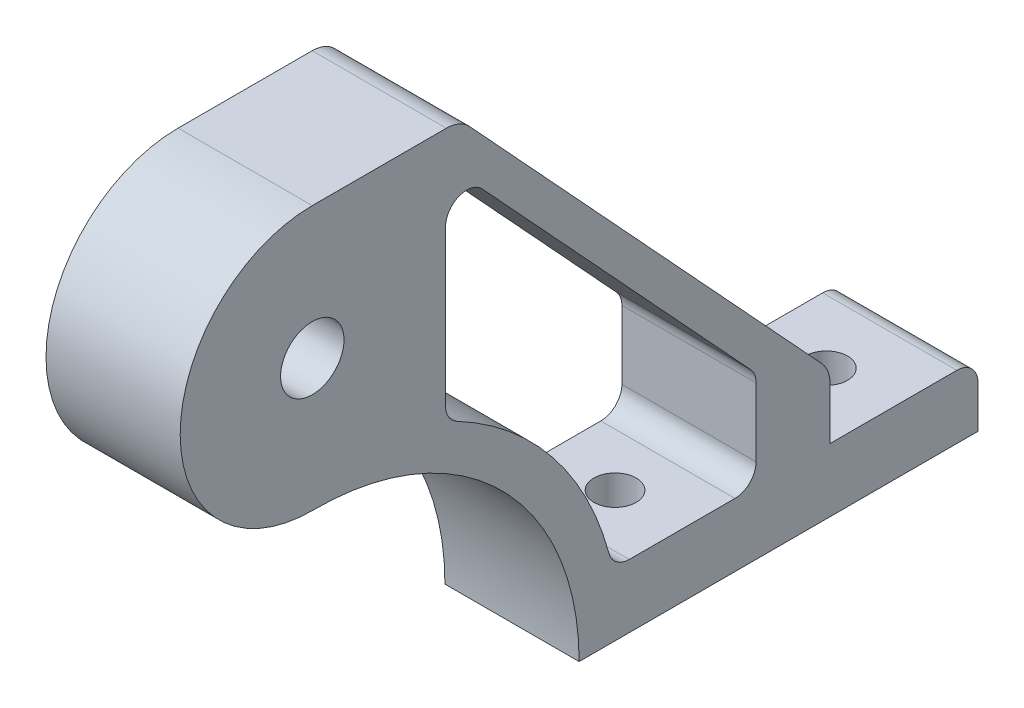
ISO-10303-21;
HEADER;
FILE_DESCRIPTION(('STEP AP214'),'2;1');
FILE_NAME('part.step','',(''),(''),'','','');
FILE_SCHEMA(('AUTOMOTIVE_DESIGN { 1 0 10303 214 1 1 1 1 }'));
ENDSEC;
DATA;
#1=APPLICATION_CONTEXT('core data for automotive mechanical design processes');
#2=APPLICATION_PROTOCOL_DEFINITION('international standard','automotive_design',2000,#1);
#3=PRODUCT_CONTEXT('',#1,'mechanical');
#4=PRODUCT('Part','Part','',(#3));
#5=PRODUCT_RELATED_PRODUCT_CATEGORY('part','',(#4));
#6=PRODUCT_DEFINITION_FORMATION('','',#4);
#7=PRODUCT_DEFINITION_CONTEXT('part definition',#1,'design');
#8=PRODUCT_DEFINITION('design','',#6,#7);
#9=PRODUCT_DEFINITION_SHAPE('','',#8);
#10=(LENGTH_UNIT() NAMED_UNIT(*) SI_UNIT(.MILLI.,.METRE.));
#11=(NAMED_UNIT(*) PLANE_ANGLE_UNIT() SI_UNIT($,.RADIAN.));
#12=(NAMED_UNIT(*) SI_UNIT($,.STERADIAN.) SOLID_ANGLE_UNIT());
#13=UNCERTAINTY_MEASURE_WITH_UNIT(LENGTH_MEASURE(1.E-05),#10,'distance_accuracy_value','');
#14=(GEOMETRIC_REPRESENTATION_CONTEXT(3) GLOBAL_UNCERTAINTY_ASSIGNED_CONTEXT((#13)) GLOBAL_UNIT_ASSIGNED_CONTEXT((#10,
#11,#12)) REPRESENTATION_CONTEXT('',''));
#15=CARTESIAN_POINT('',(0.,0.,0.));
#16=DIRECTION('',(0.,0.,1.));
#17=DIRECTION('',(1.,0.,0.));
#18=AXIS2_PLACEMENT_3D('',#15,#16,#17);
#19=CARTESIAN_POINT('',(12.7,35.5000000000114,-0.999999999997256));
#20=DIRECTION('',(-1.,0.,0.));
#21=DIRECTION('',(0.,0.,1.));
#22=AXIS2_PLACEMENT_3D('',#19,#20,#21);
#23=PLANE('',#22);
#24=CARTESIAN_POINT('',(12.7,35.5000000000114,-0.999999999997256));
#25=DIRECTION('',(1.,0.,0.));
#26=DIRECTION('',(0.,0.,-1.));
#27=AXIS2_PLACEMENT_3D('',#24,#25,#26);
#28=CIRCLE('',#27,3.);
#29=CARTESIAN_POINT('',(12.7,35.5000000000114,-3.99999999999726));
#30=VERTEX_POINT('',#29);
#31=EDGE_CURVE('E265',#30,#30,#28,.T.);
#32=ORIENTED_EDGE('',*,*,#31,.F.);
#33=EDGE_LOOP('',(#32));
#34=FACE_BOUND('',#33,.T.);
#35=CARTESIAN_POINT('',(12.7,35.5000000000114,-0.999999999997256));
#36=DIRECTION('',(1.,0.,0.));
#37=DIRECTION('',(0.,0.,1.));
#38=AXIS2_PLACEMENT_3D('',#35,#36,#37);
#39=CIRCLE('',#38,12.5);
#40=CARTESIAN_POINT('',(12.7,48.0000000000114,-0.999999999997256));
#41=VERTEX_POINT('',#40);
#42=CARTESIAN_POINT('',(12.7,23.0002868626044,-1.08468460623368));
#43=VERTEX_POINT('',#42);
#44=EDGE_CURVE('E271',#41,#43,#39,.T.);
#45=ORIENTED_EDGE('',*,*,#44,.T.);
#46=CARTESIAN_POINT('',(12.7,-1.99913941220975,-1.25405381870654));
#47=DIRECTION('',(-1.,0.,0.));
#48=DIRECTION('',(0.,0.,1.));
#49=AXIS2_PLACEMENT_3D('',#46,#47,#48);
#50=CIRCLE('',#49,25.);
#51=CARTESIAN_POINT('',(12.7,-1.99913941220964,-26.2540538187065));
#52=VERTEX_POINT('',#51);
#53=EDGE_CURVE('E274',#43,#52,#50,.T.);
#54=ORIENTED_EDGE('',*,*,#53,.T.);
#55=DIRECTION('',(0.,0.,-1.));
#56=VECTOR('',#55,1.);
#57=CARTESIAN_POINT('',(12.7,-1.99913941220964,-26.2540538187065));
#58=LINE('',#57,#56);
#59=CARTESIAN_POINT('',(12.7,-1.99913941220963,-63.9999999999972));
#60=VERTEX_POINT('',#59);
#61=EDGE_CURVE('E277',#52,#60,#58,.T.);
#62=ORIENTED_EDGE('',*,*,#61,.T.);
#63=DIRECTION('',(0.,1.,0.));
#64=VECTOR('',#63,1.);
#65=CARTESIAN_POINT('',(12.7,2.00086058779035,-63.9999999999973));
#66=LINE('',#65,#64);
#67=CARTESIAN_POINT('',(12.7,2.00086058779035,-63.9999999999973));
#68=VERTEX_POINT('',#67);
#69=EDGE_CURVE('E279',#60,#68,#66,.T.);
#70=ORIENTED_EDGE('',*,*,#69,.T.);
#71=CARTESIAN_POINT('',(12.7,2.00086058779037,-61.9999999999973));
#72=DIRECTION('',(1.,0.,0.));
#73=DIRECTION('',(0.,0.,1.));
#74=AXIS2_PLACEMENT_3D('',#71,#72,#73);
#75=CIRCLE('',#74,2.);
#76=CARTESIAN_POINT('',(12.7,4.00086058779037,-61.9999999999972));
#77=VERTEX_POINT('',#76);
#78=EDGE_CURVE('E281',#68,#77,#75,.T.);
#79=ORIENTED_EDGE('',*,*,#78,.T.);
#80=DIRECTION('',(0.,0.,1.));
#81=VECTOR('',#80,1.);
#82=CARTESIAN_POINT('',(12.7,4.00086058779036,-49.9999999999973));
#83=LINE('',#82,#81);
#84=CARTESIAN_POINT('',(12.7,4.00086058779036,-49.9999999999973));
#85=VERTEX_POINT('',#84);
#86=EDGE_CURVE('E283',#77,#85,#83,.T.);
#87=ORIENTED_EDGE('',*,*,#86,.T.);
#88=DIRECTION('',(0.,1.,0.));
#89=VECTOR('',#88,1.);
#90=CARTESIAN_POINT('',(12.7,4.00086058779036,-49.9999999999973));
#91=LINE('',#90,#89);
#92=CARTESIAN_POINT('',(12.7,8.92166748068362,-49.9999999999973));
#93=VERTEX_POINT('',#92);
#94=EDGE_CURVE('E285',#85,#93,#91,.T.);
#95=ORIENTED_EDGE('',*,*,#94,.T.);
#96=CARTESIAN_POINT('',(12.7,8.92166748068362,-46.9999999999973));
#97=DIRECTION('',(1.,0.,0.));
#98=DIRECTION('',(0.,0.,1.));
#99=AXIS2_PLACEMENT_3D('',#96,#97,#98);
#100=CIRCLE('',#99,3.);
#101=CARTESIAN_POINT('',(12.7,10.9568424444333,-49.2041013740104));
#102=VERTEX_POINT('',#101);
#103=EDGE_CURVE('E287',#93,#102,#100,.T.);
#104=ORIENTED_EDGE('',*,*,#103,.T.);
#105=DIRECTION('',(0.,0.734700458004377,0.67839165458322));
#106=VECTOR('',#105,1.);
#107=CARTESIAN_POINT('',(12.7,10.9568424444333,-49.2041013740104));
#108=LINE('',#107,#106);
#109=CARTESIAN_POINT('',(12.7,47.0351749637611,-15.8908790590672));
#110=VERTEX_POINT('',#109);
#111=EDGE_CURVE('E289',#102,#110,#108,.T.);
#112=ORIENTED_EDGE('',*,*,#111,.T.);
#113=CARTESIAN_POINT('',(12.7,45.0000000000114,-13.6867776850541));
#114=DIRECTION('',(1.,0.,0.));
#115=DIRECTION('',(0.,0.,-1.));
#116=AXIS2_PLACEMENT_3D('',#113,#114,#115);
#117=CIRCLE('',#116,3.);
#118=CARTESIAN_POINT('',(12.7,48.0000000000114,-13.6867776850541));
#119=VERTEX_POINT('',#118);
#120=EDGE_CURVE('E291',#110,#119,#117,.T.);
#121=ORIENTED_EDGE('',*,*,#120,.T.);
#122=DIRECTION('',(0.,0.,1.));
#123=VECTOR('',#122,1.);
#124=CARTESIAN_POINT('',(12.7,48.0000000000114,-0.999999999997256));
#125=LINE('',#124,#123);
#126=EDGE_CURVE('E293',#119,#41,#125,.T.);
#127=ORIENTED_EDGE('',*,*,#126,.T.);
#128=EDGE_LOOP('',(#45,#54,#62,#70,#79,#87,#95,#104,#112,#121,#127));
#129=FACE_BOUND('',#128,.T.);
#130=CARTESIAN_POINT('',(12.7,12.4715383137878,-40.9999999999973));
#131=DIRECTION('',(1.,0.,0.));
#132=DIRECTION('',(0.,0.,1.));
#133=AXIS2_PLACEMENT_3D('',#130,#131,#132);
#134=CIRCLE('',#133,2.);
#135=CARTESIAN_POINT('',(12.7,12.4715383137878,-42.9999999999973));
#136=VERTEX_POINT('',#135);
#137=CARTESIAN_POINT('',(12.7,13.8283216229542,-42.469400916006));
#138=VERTEX_POINT('',#137);
#139=EDGE_CURVE('E184',#136,#138,#134,.T.);
#140=ORIENTED_EDGE('',*,*,#139,.F.);
#141=DIRECTION('',(0.,1.,0.));
#142=VECTOR('',#141,1.);
#143=CARTESIAN_POINT('',(12.7,12.4715383137878,-42.9999999999973));
#144=LINE('',#143,#142);
#145=CARTESIAN_POINT('',(12.7,6.00086058779037,-42.9999999999973));
#146=VERTEX_POINT('',#145);
#147=EDGE_CURVE('E222',#146,#136,#144,.T.);
#148=ORIENTED_EDGE('',*,*,#147,.F.);
#149=CARTESIAN_POINT('',(12.7,6.00086058779037,-40.9999999999973));
#150=DIRECTION('',(1.,0.,0.));
#151=DIRECTION('',(0.,0.,1.));
#152=AXIS2_PLACEMENT_3D('',#149,#150,#151);
#153=CIRCLE('',#152,2.);
#154=CARTESIAN_POINT('',(12.7,4.00086058779036,-40.9999999999973));
#155=VERTEX_POINT('',#154);
#156=EDGE_CURVE('E220',#155,#146,#153,.T.);
#157=ORIENTED_EDGE('',*,*,#156,.F.);
#158=DIRECTION('',(0.,0.,-1.));
#159=VECTOR('',#158,1.);
#160=CARTESIAN_POINT('',(12.7,4.00086058779036,-40.9999999999973));
#161=LINE('',#160,#159);
#162=CARTESIAN_POINT('',(12.7,4.00086058779037,-30.9999999999973));
#163=VERTEX_POINT('',#162);
#164=EDGE_CURVE('E218',#163,#155,#161,.T.);
#165=ORIENTED_EDGE('',*,*,#164,.F.);
#166=CARTESIAN_POINT('',(12.7,6.00086058779036,-30.9999999999973));
#167=DIRECTION('',(1.,0.,0.));
#168=DIRECTION('',(0.,0.,1.));
#169=AXIS2_PLACEMENT_3D('',#166,#167,#168);
#170=CIRCLE('',#169,2.);
#171=CARTESIAN_POINT('',(12.7,5.4814297055303,-29.0686296164212));
#172=VERTEX_POINT('',#171);
#173=EDGE_CURVE('E216',#172,#163,#170,.T.);
#174=ORIENTED_EDGE('',*,*,#173,.F.);
#175=CARTESIAN_POINT('',(12.7,-1.99913941220975,-1.25405381870654));
#176=DIRECTION('',(-1.,0.,0.));
#177=DIRECTION('',(0.,0.,-1.));
#178=AXIS2_PLACEMENT_3D('',#175,#176,#177);
#179=CIRCLE('',#178,28.8029432720356);
#180=CARTESIAN_POINT('',(12.7,23.4822233319297,-14.6819983313147));
#181=VERTEX_POINT('',#180);
#182=EDGE_CURVE('E214',#181,#172,#179,.T.);
#183=ORIENTED_EDGE('',*,*,#182,.F.);
#184=CARTESIAN_POINT('',(12.7,25.2515815883742,-15.6143991895038));
#185=DIRECTION('',(1.,0.,0.));
#186=DIRECTION('',(0.,0.,-1.));
#187=AXIS2_PLACEMENT_3D('',#184,#185,#186);
#188=CIRCLE('',#187,2.);
#189=CARTESIAN_POINT('',(12.7,25.2515815883742,-13.6143991895038));
#190=VERTEX_POINT('',#189);
#191=EDGE_CURVE('E212',#190,#181,#188,.T.);
#192=ORIENTED_EDGE('',*,*,#191,.F.);
#193=DIRECTION('',(0.,-1.,0.));
#194=VECTOR('',#193,1.);
#195=CARTESIAN_POINT('',(12.7,39.9642299118946,-13.6143991895038));
#196=LINE('',#195,#194);
#197=CARTESIAN_POINT('',(12.7,39.9642299118946,-13.6143991895038));
#198=VERTEX_POINT('',#197);
#199=EDGE_CURVE('E207',#198,#190,#196,.T.);
#200=ORIENTED_EDGE('',*,*,#199,.F.);
#201=CARTESIAN_POINT('',(12.7,39.9642299118946,-15.6143991895038));
#202=DIRECTION('',(1.,0.,0.));
#203=DIRECTION('',(0.,0.,-1.));
#204=AXIS2_PLACEMENT_3D('',#201,#202,#203);
#205=CIRCLE('',#204,2.);
#206=CARTESIAN_POINT('',(12.7,41.321013221061,-17.0838001055125));
#207=VERTEX_POINT('',#206);
#208=EDGE_CURVE('E205',#207,#198,#205,.T.);
#209=ORIENTED_EDGE('',*,*,#208,.F.);
#210=DIRECTION('',(0.,0.734700458004377,0.67839165458322));
#211=VECTOR('',#210,1.);
#212=CARTESIAN_POINT('',(12.7,13.8283216229542,-42.469400916006));
#213=LINE('',#212,#211);
#214=EDGE_CURVE('E192',#138,#207,#213,.T.);
#215=ORIENTED_EDGE('',*,*,#214,.F.);
#216=EDGE_LOOP('',(#140,#148,#157,#165,#174,#183,#192,#200,#209,#215));
#217=FACE_BOUND('',#216,.T.);
#218=ADVANCED_FACE('F41',(#34,#129,#217),#23,.F.);
#219=CARTESIAN_POINT('',(0.,35.5000000000114,-0.999999999997256));
#220=DIRECTION('',(-1.,0.,0.));
#221=DIRECTION('',(0.,0.,1.));
#222=AXIS2_PLACEMENT_3D('',#219,#220,#221);
#223=PLANE('',#222);
#224=CARTESIAN_POINT('',(0.,35.5000000000114,-0.999999999997256));
#225=DIRECTION('',(1.,0.,0.));
#226=DIRECTION('',(0.,0.,1.));
#227=AXIS2_PLACEMENT_3D('',#224,#225,#226);
#228=CIRCLE('',#227,12.5);
#229=CARTESIAN_POINT('',(0.,48.0000000000114,-0.999999999997256));
#230=VERTEX_POINT('',#229);
#231=CARTESIAN_POINT('',(0.,23.0002868626044,-1.08468460623368));
#232=VERTEX_POINT('',#231);
#233=EDGE_CURVE('E268',#230,#232,#228,.T.);
#234=ORIENTED_EDGE('',*,*,#233,.F.);
#235=DIRECTION('',(0.,0.,1.));
#236=VECTOR('',#235,1.);
#237=CARTESIAN_POINT('',(0.,48.0000000000114,-0.999999999997256));
#238=LINE('',#237,#236);
#239=CARTESIAN_POINT('',(0.,48.0000000000114,-13.6867776850541));
#240=VERTEX_POINT('',#239);
#241=EDGE_CURVE('E275',#240,#230,#238,.T.);
#242=ORIENTED_EDGE('',*,*,#241,.F.);
#243=CARTESIAN_POINT('',(0.,45.0000000000114,-13.6867776850541));
#244=DIRECTION('',(1.,0.,0.));
#245=DIRECTION('',(0.,0.,-1.));
#246=AXIS2_PLACEMENT_3D('',#243,#244,#245);
#247=CIRCLE('',#246,3.);
#248=CARTESIAN_POINT('',(0.,47.0351749637611,-15.8908790590672));
#249=VERTEX_POINT('',#248);
#250=EDGE_CURVE('E314',#249,#240,#247,.T.);
#251=ORIENTED_EDGE('',*,*,#250,.F.);
#252=DIRECTION('',(0.,0.734700458004377,0.67839165458322));
#253=VECTOR('',#252,1.);
#254=CARTESIAN_POINT('',(0.,10.9568424444333,-49.2041013740104));
#255=LINE('',#254,#253);
#256=CARTESIAN_POINT('',(0.,10.9568424444333,-49.2041013740104));
#257=VERTEX_POINT('',#256);
#258=EDGE_CURVE('E312',#257,#249,#255,.T.);
#259=ORIENTED_EDGE('',*,*,#258,.F.);
#260=CARTESIAN_POINT('',(0.,8.92166748068362,-46.9999999999973));
#261=DIRECTION('',(1.,0.,0.));
#262=DIRECTION('',(0.,0.,1.));
#263=AXIS2_PLACEMENT_3D('',#260,#261,#262);
#264=CIRCLE('',#263,3.);
#265=CARTESIAN_POINT('',(0.,8.92166748068362,-49.9999999999973));
#266=VERTEX_POINT('',#265);
#267=EDGE_CURVE('E310',#266,#257,#264,.T.);
#268=ORIENTED_EDGE('',*,*,#267,.F.);
#269=DIRECTION('',(0.,1.,0.));
#270=VECTOR('',#269,1.);
#271=CARTESIAN_POINT('',(0.,4.00086058779036,-49.9999999999973));
#272=LINE('',#271,#270);
#273=CARTESIAN_POINT('',(0.,4.00086058779036,-49.9999999999973));
#274=VERTEX_POINT('',#273);
#275=EDGE_CURVE('E308',#274,#266,#272,.T.);
#276=ORIENTED_EDGE('',*,*,#275,.F.);
#277=DIRECTION('',(0.,0.,1.));
#278=VECTOR('',#277,1.);
#279=CARTESIAN_POINT('',(0.,4.00086058779036,-49.9999999999973));
#280=LINE('',#279,#278);
#281=CARTESIAN_POINT('',(0.,4.00086058779037,-61.9999999999972));
#282=VERTEX_POINT('',#281);
#283=EDGE_CURVE('E306',#282,#274,#280,.T.);
#284=ORIENTED_EDGE('',*,*,#283,.F.);
#285=CARTESIAN_POINT('',(0.,2.00086058779037,-61.9999999999973));
#286=DIRECTION('',(1.,0.,0.));
#287=DIRECTION('',(0.,0.,1.));
#288=AXIS2_PLACEMENT_3D('',#285,#286,#287);
#289=CIRCLE('',#288,2.);
#290=CARTESIAN_POINT('',(0.,2.00086058779035,-63.9999999999973));
#291=VERTEX_POINT('',#290);
#292=EDGE_CURVE('E304',#291,#282,#289,.T.);
#293=ORIENTED_EDGE('',*,*,#292,.F.);
#294=DIRECTION('',(0.,1.,0.));
#295=VECTOR('',#294,1.);
#296=CARTESIAN_POINT('',(0.,2.00086058779035,-63.9999999999973));
#297=LINE('',#296,#295);
#298=CARTESIAN_POINT('',(0.,-1.99913941220963,-63.9999999999972));
#299=VERTEX_POINT('',#298);
#300=EDGE_CURVE('E302',#299,#291,#297,.T.);
#301=ORIENTED_EDGE('',*,*,#300,.F.);
#302=DIRECTION('',(0.,0.,-1.));
#303=VECTOR('',#302,1.);
#304=CARTESIAN_POINT('',(0.,-1.99913941220964,-26.2540538187065));
#305=LINE('',#304,#303);
#306=CARTESIAN_POINT('',(0.,-1.99913941220964,-26.2540538187065));
#307=VERTEX_POINT('',#306);
#308=EDGE_CURVE('E300',#307,#299,#305,.T.);
#309=ORIENTED_EDGE('',*,*,#308,.F.);
#310=CARTESIAN_POINT('',(0.,-1.99913941220975,-1.25405381870654));
#311=DIRECTION('',(-1.,0.,0.));
#312=DIRECTION('',(0.,0.,1.));
#313=AXIS2_PLACEMENT_3D('',#310,#311,#312);
#314=CIRCLE('',#313,25.);
#315=EDGE_CURVE('E298',#232,#307,#314,.T.);
#316=ORIENTED_EDGE('',*,*,#315,.F.);
#317=EDGE_LOOP('',(#234,#242,#251,#259,#268,#276,#284,#293,#301,#309,#316));
#318=FACE_BOUND('',#317,.T.);
#319=CARTESIAN_POINT('',(0.,35.5000000000114,-0.999999999997256));
#320=DIRECTION('',(1.,0.,0.));
#321=DIRECTION('',(0.,0.,-1.));
#322=AXIS2_PLACEMENT_3D('',#319,#320,#321);
#323=CIRCLE('',#322,3.);
#324=CARTESIAN_POINT('',(0.,35.5000000000114,-3.99999999999726));
#325=VERTEX_POINT('',#324);
#326=EDGE_CURVE('E200',#325,#325,#323,.T.);
#327=ORIENTED_EDGE('',*,*,#326,.T.);
#328=EDGE_LOOP('',(#327));
#329=FACE_BOUND('',#328,.T.);
#330=DIRECTION('',(0.,1.,0.));
#331=VECTOR('',#330,1.);
#332=CARTESIAN_POINT('',(0.,12.4715383137878,-42.9999999999973));
#333=LINE('',#332,#331);
#334=CARTESIAN_POINT('',(0.,6.00086058779037,-42.9999999999973));
#335=VERTEX_POINT('',#334);
#336=CARTESIAN_POINT('',(0.,12.4715383137878,-42.9999999999973));
#337=VERTEX_POINT('',#336);
#338=EDGE_CURVE('E193',#335,#337,#333,.T.);
#339=ORIENTED_EDGE('',*,*,#338,.T.);
#340=CARTESIAN_POINT('',(0.,12.4715383137878,-40.9999999999973));
#341=DIRECTION('',(1.,0.,0.));
#342=DIRECTION('',(0.,0.,1.));
#343=AXIS2_PLACEMENT_3D('',#340,#341,#342);
#344=CIRCLE('',#343,2.);
#345=CARTESIAN_POINT('',(0.,13.8283216229542,-42.469400916006));
#346=VERTEX_POINT('',#345);
#347=EDGE_CURVE('E64',#337,#346,#344,.T.);
#348=ORIENTED_EDGE('',*,*,#347,.T.);
#349=DIRECTION('',(0.,0.734700458004377,0.67839165458322));
#350=VECTOR('',#349,1.);
#351=CARTESIAN_POINT('',(0.,13.8283216229542,-42.469400916006));
#352=LINE('',#351,#350);
#353=CARTESIAN_POINT('',(0.,41.321013221061,-17.0838001055125));
#354=VERTEX_POINT('',#353);
#355=EDGE_CURVE('E199',#346,#354,#352,.T.);
#356=ORIENTED_EDGE('',*,*,#355,.T.);
#357=CARTESIAN_POINT('',(0.,39.9642299118946,-15.6143991895038));
#358=DIRECTION('',(1.,0.,0.));
#359=DIRECTION('',(0.,0.,-1.));
#360=AXIS2_PLACEMENT_3D('',#357,#358,#359);
#361=CIRCLE('',#360,2.);
#362=CARTESIAN_POINT('',(0.,39.9642299118946,-13.6143991895038));
#363=VERTEX_POINT('',#362);
#364=EDGE_CURVE('E227',#354,#363,#361,.T.);
#365=ORIENTED_EDGE('',*,*,#364,.T.);
#366=DIRECTION('',(0.,-1.,0.));
#367=VECTOR('',#366,1.);
#368=CARTESIAN_POINT('',(0.,39.9642299118946,-13.6143991895038));
#369=LINE('',#368,#367);
#370=CARTESIAN_POINT('',(0.,25.2515815883742,-13.6143991895038));
#371=VERTEX_POINT('',#370);
#372=EDGE_CURVE('E230',#363,#371,#369,.T.);
#373=ORIENTED_EDGE('',*,*,#372,.T.);
#374=CARTESIAN_POINT('',(0.,25.2515815883742,-15.6143991895038));
#375=DIRECTION('',(1.,0.,0.));
#376=DIRECTION('',(0.,0.,-1.));
#377=AXIS2_PLACEMENT_3D('',#374,#375,#376);
#378=CIRCLE('',#377,2.);
#379=CARTESIAN_POINT('',(0.,23.4822233319297,-14.6819983313147));
#380=VERTEX_POINT('',#379);
#381=EDGE_CURVE('E233',#371,#380,#378,.T.);
#382=ORIENTED_EDGE('',*,*,#381,.T.);
#383=CARTESIAN_POINT('',(0.,-1.99913941220975,-1.25405381870654));
#384=DIRECTION('',(-1.,0.,0.));
#385=DIRECTION('',(0.,0.,-1.));
#386=AXIS2_PLACEMENT_3D('',#383,#384,#385);
#387=CIRCLE('',#386,28.8029432720356);
#388=CARTESIAN_POINT('',(0.,5.4814297055303,-29.0686296164212));
#389=VERTEX_POINT('',#388);
#390=EDGE_CURVE('E236',#380,#389,#387,.T.);
#391=ORIENTED_EDGE('',*,*,#390,.T.);
#392=CARTESIAN_POINT('',(0.,6.00086058779036,-30.9999999999973));
#393=DIRECTION('',(1.,0.,0.));
#394=DIRECTION('',(0.,0.,1.));
#395=AXIS2_PLACEMENT_3D('',#392,#393,#394);
#396=CIRCLE('',#395,2.);
#397=CARTESIAN_POINT('',(0.,4.00086058779037,-30.9999999999973));
#398=VERTEX_POINT('',#397);
#399=EDGE_CURVE('E239',#389,#398,#396,.T.);
#400=ORIENTED_EDGE('',*,*,#399,.T.);
#401=DIRECTION('',(0.,0.,-1.));
#402=VECTOR('',#401,1.);
#403=CARTESIAN_POINT('',(0.,4.00086058779036,-40.9999999999973));
#404=LINE('',#403,#402);
#405=CARTESIAN_POINT('',(0.,4.00086058779036,-40.9999999999973));
#406=VERTEX_POINT('',#405);
#407=EDGE_CURVE('E242',#398,#406,#404,.T.);
#408=ORIENTED_EDGE('',*,*,#407,.T.);
#409=CARTESIAN_POINT('',(0.,6.00086058779037,-40.9999999999973));
#410=DIRECTION('',(1.,0.,0.));
#411=DIRECTION('',(0.,0.,1.));
#412=AXIS2_PLACEMENT_3D('',#409,#410,#411);
#413=CIRCLE('',#412,2.);
#414=EDGE_CURVE('E245',#406,#335,#413,.T.);
#415=ORIENTED_EDGE('',*,*,#414,.T.);
#416=EDGE_LOOP('',(#339,#348,#356,#365,#373,#382,#391,#400,#408,#415));
#417=FACE_BOUND('',#416,.T.);
#418=ADVANCED_FACE('F353',(#318,#329,#417),#223,.T.);
#419=CARTESIAN_POINT('',(12.7,35.5000000000114,-0.999999999997256));
#420=DIRECTION('',(-1.,0.,0.));
#421=DIRECTION('',(0.,0.,1.));
#422=AXIS2_PLACEMENT_3D('',#419,#420,#421);
#423=CYLINDRICAL_SURFACE('',#422,12.5);
#424=ORIENTED_EDGE('',*,*,#233,.T.);
#425=DIRECTION('',(-1.,0.,0.));
#426=VECTOR('',#425,1.);
#427=CARTESIAN_POINT('',(12.7,23.0002868626044,-1.08468460623368));
#428=LINE('',#427,#426);
#429=EDGE_CURVE('E11',#43,#232,#428,.T.);
#430=ORIENTED_EDGE('',*,*,#429,.F.);
#431=ORIENTED_EDGE('',*,*,#44,.F.);
#432=DIRECTION('',(-1.,0.,0.));
#433=VECTOR('',#432,1.);
#434=CARTESIAN_POINT('',(12.7,48.0000000000114,-0.999999999997256));
#435=LINE('',#434,#433);
#436=EDGE_CURVE('E295',#41,#230,#435,.T.);
#437=ORIENTED_EDGE('',*,*,#436,.T.);
#438=EDGE_LOOP('',(#424,#430,#431,#437));
#439=FACE_BOUND('',#438,.T.);
#440=ADVANCED_FACE('F43',(#439),#423,.T.);
#441=CARTESIAN_POINT('',(12.7,-1.99913941220975,-1.25405381870654));
#442=DIRECTION('',(-1.,0.,0.));
#443=DIRECTION('',(0.,0.,1.));
#444=AXIS2_PLACEMENT_3D('',#441,#442,#443);
#445=CYLINDRICAL_SURFACE('',#444,25.);
#446=ORIENTED_EDGE('',*,*,#315,.T.);
#447=DIRECTION('',(-1.,0.,0.));
#448=VECTOR('',#447,1.);
#449=CARTESIAN_POINT('',(12.7,-1.99913941220964,-26.2540538187065));
#450=LINE('',#449,#448);
#451=EDGE_CURVE('E49',#52,#307,#450,.T.);
#452=ORIENTED_EDGE('',*,*,#451,.F.);
#453=ORIENTED_EDGE('',*,*,#53,.F.);
#454=ORIENTED_EDGE('',*,*,#429,.T.);
#455=EDGE_LOOP('',(#446,#452,#453,#454));
#456=FACE_BOUND('',#455,.T.);
#457=ADVANCED_FACE('F370',(#456),#445,.F.);
#458=CARTESIAN_POINT('',(12.7,-1.99913941220964,-26.2540538187065));
#459=DIRECTION('',(0.,1.,0.));
#460=DIRECTION('',(0.,0.,1.));
#461=AXIS2_PLACEMENT_3D('',#458,#459,#460);
#462=PLANE('',#461);
#463=CARTESIAN_POINT('',(6.35,-1.99913941220963,-55.9999999999972));
#464=DIRECTION('',(0.,1.,0.));
#465=DIRECTION('',(0.,0.,1.));
#466=AXIS2_PLACEMENT_3D('',#463,#464,#465);
#467=CIRCLE('',#466,2.);
#468=CARTESIAN_POINT('',(6.35,-1.99913941220963,-53.9999999999972));
#469=VERTEX_POINT('',#468);
#470=EDGE_CURVE('E225',#469,#469,#467,.T.);
#471=ORIENTED_EDGE('',*,*,#470,.T.);
#472=EDGE_LOOP('',(#471));
#473=FACE_BOUND('',#472,.T.);
#474=CARTESIAN_POINT('',(6.35,-1.99913941220963,-35.9999999999973));
#475=DIRECTION('',(0.,1.,0.));
#476=DIRECTION('',(0.,0.,1.));
#477=AXIS2_PLACEMENT_3D('',#474,#475,#476);
#478=CIRCLE('',#477,2.);
#479=CARTESIAN_POINT('',(6.35,-1.99913941220963,-33.9999999999973));
#480=VERTEX_POINT('',#479);
#481=EDGE_CURVE('E688',#480,#480,#478,.T.);
#482=ORIENTED_EDGE('',*,*,#481,.T.);
#483=EDGE_LOOP('',(#482));
#484=FACE_BOUND('',#483,.T.);
#485=ORIENTED_EDGE('',*,*,#308,.T.);
#486=DIRECTION('',(-1.,0.,0.));
#487=VECTOR('',#486,1.);
#488=CARTESIAN_POINT('',(12.7,-1.99913941220963,-63.9999999999972));
#489=LINE('',#488,#487);
#490=EDGE_CURVE('E340',#60,#299,#489,.T.);
#491=ORIENTED_EDGE('',*,*,#490,.F.);
#492=ORIENTED_EDGE('',*,*,#61,.F.);
#493=ORIENTED_EDGE('',*,*,#451,.T.);
#494=EDGE_LOOP('',(#485,#491,#492,#493));
#495=FACE_BOUND('',#494,.T.);
#496=ADVANCED_FACE('F347',(#473,#484,#495),#462,.F.);
#497=CARTESIAN_POINT('',(12.7,2.00086058779035,-63.9999999999973));
#498=DIRECTION('',(0.,0.,1.));
#499=DIRECTION('',(0.,-1.,0.));
#500=AXIS2_PLACEMENT_3D('',#497,#498,#499);
#501=PLANE('',#500);
#502=ORIENTED_EDGE('',*,*,#300,.T.);
#503=DIRECTION('',(-1.,0.,0.));
#504=VECTOR('',#503,1.);
#505=CARTESIAN_POINT('',(12.7,2.00086058779035,-63.9999999999973));
#506=LINE('',#505,#504);
#507=EDGE_CURVE('E337',#68,#291,#506,.T.);
#508=ORIENTED_EDGE('',*,*,#507,.F.);
#509=ORIENTED_EDGE('',*,*,#69,.F.);
#510=ORIENTED_EDGE('',*,*,#490,.T.);
#511=EDGE_LOOP('',(#502,#508,#509,#510));
#512=FACE_BOUND('',#511,.T.);
#513=ADVANCED_FACE('F359',(#512),#501,.F.);
#514=CARTESIAN_POINT('',(12.7,2.00086058779037,-61.9999999999973));
#515=DIRECTION('',(-1.,0.,0.));
#516=DIRECTION('',(0.,0.,1.));
#517=AXIS2_PLACEMENT_3D('',#514,#515,#516);
#518=CYLINDRICAL_SURFACE('',#517,2.);
#519=ORIENTED_EDGE('',*,*,#292,.T.);
#520=DIRECTION('',(-1.,0.,0.));
#521=VECTOR('',#520,1.);
#522=CARTESIAN_POINT('',(12.7,4.00086058779037,-61.9999999999972));
#523=LINE('',#522,#521);
#524=EDGE_CURVE('E334',#77,#282,#523,.T.);
#525=ORIENTED_EDGE('',*,*,#524,.F.);
#526=ORIENTED_EDGE('',*,*,#78,.F.);
#527=ORIENTED_EDGE('',*,*,#507,.T.);
#528=EDGE_LOOP('',(#519,#525,#526,#527));
#529=FACE_BOUND('',#528,.T.);
#530=ADVANCED_FACE('F363',(#529),#518,.T.);
#531=CARTESIAN_POINT('',(12.7,4.00086058779036,-49.9999999999973));
#532=DIRECTION('',(0.,-1.,0.));
#533=DIRECTION('',(0.,0.,-1.));
#534=AXIS2_PLACEMENT_3D('',#531,#532,#533);
#535=PLANE('',#534);
#536=CARTESIAN_POINT('',(6.35,4.00086058779037,-55.9999999999972));
#537=DIRECTION('',(0.,1.,0.));
#538=DIRECTION('',(0.,0.,1.));
#539=AXIS2_PLACEMENT_3D('',#536,#537,#538);
#540=CIRCLE('',#539,2.);
#541=CARTESIAN_POINT('',(6.35,4.00086058779037,-53.9999999999972));
#542=VERTEX_POINT('',#541);
#543=EDGE_CURVE('E690',#542,#542,#540,.T.);
#544=ORIENTED_EDGE('',*,*,#543,.F.);
#545=EDGE_LOOP('',(#544));
#546=FACE_BOUND('',#545,.T.);
#547=ORIENTED_EDGE('',*,*,#283,.T.);
#548=DIRECTION('',(-1.,0.,0.));
#549=VECTOR('',#548,1.);
#550=CARTESIAN_POINT('',(12.7,4.00086058779036,-49.9999999999973));
#551=LINE('',#550,#549);
#552=EDGE_CURVE('E331',#85,#274,#551,.T.);
#553=ORIENTED_EDGE('',*,*,#552,.F.);
#554=ORIENTED_EDGE('',*,*,#86,.F.);
#555=ORIENTED_EDGE('',*,*,#524,.T.);
#556=EDGE_LOOP('',(#547,#553,#554,#555));
#557=FACE_BOUND('',#556,.T.);
#558=ADVANCED_FACE('F398',(#546,#557),#535,.F.);
#559=CARTESIAN_POINT('',(12.7,4.00086058779036,-49.9999999999973));
#560=DIRECTION('',(0.,0.,1.));
#561=DIRECTION('',(0.,-1.,0.));
#562=AXIS2_PLACEMENT_3D('',#559,#560,#561);
#563=PLANE('',#562);
#564=ORIENTED_EDGE('',*,*,#275,.T.);
#565=DIRECTION('',(-1.,0.,0.));
#566=VECTOR('',#565,1.);
#567=CARTESIAN_POINT('',(12.7,8.92166748068362,-49.9999999999973));
#568=LINE('',#567,#566);
#569=EDGE_CURVE('E328',#93,#266,#568,.T.);
#570=ORIENTED_EDGE('',*,*,#569,.F.);
#571=ORIENTED_EDGE('',*,*,#94,.F.);
#572=ORIENTED_EDGE('',*,*,#552,.T.);
#573=EDGE_LOOP('',(#564,#570,#571,#572));
#574=FACE_BOUND('',#573,.T.);
#575=ADVANCED_FACE('F396',(#574),#563,.F.);
#576=CARTESIAN_POINT('',(12.7,8.92166748068362,-46.9999999999973));
#577=DIRECTION('',(-1.,0.,0.));
#578=DIRECTION('',(0.,0.,1.));
#579=AXIS2_PLACEMENT_3D('',#576,#577,#578);
#580=CYLINDRICAL_SURFACE('',#579,3.);
#581=ORIENTED_EDGE('',*,*,#267,.T.);
#582=DIRECTION('',(-1.,0.,0.));
#583=VECTOR('',#582,1.);
#584=CARTESIAN_POINT('',(12.7,10.9568424444333,-49.2041013740104));
#585=LINE('',#584,#583);
#586=EDGE_CURVE('E325',#102,#257,#585,.T.);
#587=ORIENTED_EDGE('',*,*,#586,.F.);
#588=ORIENTED_EDGE('',*,*,#103,.F.);
#589=ORIENTED_EDGE('',*,*,#569,.T.);
#590=EDGE_LOOP('',(#581,#587,#588,#589));
#591=FACE_BOUND('',#590,.T.);
#592=ADVANCED_FACE('F391',(#591),#580,.T.);
#593=CARTESIAN_POINT('',(12.7,10.9568424444333,-49.2041013740104));
#594=DIRECTION('',(0.,-0.67839165458322,0.734700458004377));
#595=DIRECTION('',(0.,-0.734700458004377,-0.67839165458322));
#596=AXIS2_PLACEMENT_3D('',#593,#594,#595);
#597=PLANE('',#596);
#598=ORIENTED_EDGE('',*,*,#258,.T.);
#599=DIRECTION('',(-1.,0.,0.));
#600=VECTOR('',#599,1.);
#601=CARTESIAN_POINT('',(12.7,47.0351749637611,-15.8908790590672));
#602=LINE('',#601,#600);
#603=EDGE_CURVE('E322',#110,#249,#602,.T.);
#604=ORIENTED_EDGE('',*,*,#603,.F.);
#605=ORIENTED_EDGE('',*,*,#111,.F.);
#606=ORIENTED_EDGE('',*,*,#586,.T.);
#607=EDGE_LOOP('',(#598,#604,#605,#606));
#608=FACE_BOUND('',#607,.T.);
#609=ADVANCED_FACE('F386',(#608),#597,.F.);
#610=CARTESIAN_POINT('',(12.7,45.0000000000114,-13.6867776850541));
#611=DIRECTION('',(-1.,0.,0.));
#612=DIRECTION('',(0.,0.,1.));
#613=AXIS2_PLACEMENT_3D('',#610,#611,#612);
#614=CYLINDRICAL_SURFACE('',#613,3.);
#615=ORIENTED_EDGE('',*,*,#250,.T.);
#616=DIRECTION('',(-1.,0.,0.));
#617=VECTOR('',#616,1.);
#618=CARTESIAN_POINT('',(12.7,48.0000000000114,-13.6867776850541));
#619=LINE('',#618,#617);
#620=EDGE_CURVE('E319',#119,#240,#619,.T.);
#621=ORIENTED_EDGE('',*,*,#620,.F.);
#622=ORIENTED_EDGE('',*,*,#120,.F.);
#623=ORIENTED_EDGE('',*,*,#603,.T.);
#624=EDGE_LOOP('',(#615,#621,#622,#623));
#625=FACE_BOUND('',#624,.T.);
#626=ADVANCED_FACE('F382',(#625),#614,.T.);
#627=CARTESIAN_POINT('',(12.7,48.0000000000114,-0.999999999997256));
#628=DIRECTION('',(0.,-1.,0.));
#629=DIRECTION('',(0.,0.,-1.));
#630=AXIS2_PLACEMENT_3D('',#627,#628,#629);
#631=PLANE('',#630);
#632=ORIENTED_EDGE('',*,*,#241,.T.);
#633=ORIENTED_EDGE('',*,*,#436,.F.);
#634=ORIENTED_EDGE('',*,*,#126,.F.);
#635=ORIENTED_EDGE('',*,*,#620,.T.);
#636=EDGE_LOOP('',(#632,#633,#634,#635));
#637=FACE_BOUND('',#636,.T.);
#638=ADVANCED_FACE('F377',(#637),#631,.F.);
#639=CARTESIAN_POINT('',(12.7,35.5000000000114,-0.999999999997256));
#640=DIRECTION('',(-1.,0.,0.));
#641=DIRECTION('',(0.,0.,1.));
#642=AXIS2_PLACEMENT_3D('',#639,#640,#641);
#643=CYLINDRICAL_SURFACE('',#642,3.);
#644=ORIENTED_EDGE('',*,*,#31,.T.);
#645=EDGE_LOOP('',(#644));
#646=FACE_BOUND('',#645,.T.);
#647=ORIENTED_EDGE('',*,*,#326,.F.);
#648=EDGE_LOOP('',(#647));
#649=FACE_BOUND('',#648,.T.);
#650=ADVANCED_FACE('F418',(#646,#649),#643,.F.);
#651=CARTESIAN_POINT('',(12.7,12.4715383137878,-40.9999999999973));
#652=DIRECTION('',(-1.,0.,0.));
#653=DIRECTION('',(0.,0.,1.));
#654=AXIS2_PLACEMENT_3D('',#651,#652,#653);
#655=CYLINDRICAL_SURFACE('',#654,2.);
#656=ORIENTED_EDGE('',*,*,#347,.F.);
#657=DIRECTION('',(-1.,0.,0.));
#658=VECTOR('',#657,1.);
#659=CARTESIAN_POINT('',(12.7,12.4715383137878,-42.9999999999973));
#660=LINE('',#659,#658);
#661=EDGE_CURVE('E188',#136,#337,#660,.T.);
#662=ORIENTED_EDGE('',*,*,#661,.F.);
#663=ORIENTED_EDGE('',*,*,#139,.T.);
#664=DIRECTION('',(-1.,0.,0.));
#665=VECTOR('',#664,1.);
#666=CARTESIAN_POINT('',(12.7,13.8283216229542,-42.469400916006));
#667=LINE('',#666,#665);
#668=EDGE_CURVE('E187',#138,#346,#667,.T.);
#669=ORIENTED_EDGE('',*,*,#668,.T.);
#670=EDGE_LOOP('',(#656,#662,#663,#669));
#671=FACE_BOUND('',#670,.T.);
#672=ADVANCED_FACE('F186',(#671),#655,.F.);
#673=CARTESIAN_POINT('',(12.7,13.8283216229542,-42.469400916006));
#674=DIRECTION('',(0.,-0.67839165458322,0.734700458004377));
#675=DIRECTION('',(0.,-0.734700458004377,-0.67839165458322));
#676=AXIS2_PLACEMENT_3D('',#673,#674,#675);
#677=PLANE('',#676);
#678=ORIENTED_EDGE('',*,*,#355,.F.);
#679=ORIENTED_EDGE('',*,*,#668,.F.);
#680=ORIENTED_EDGE('',*,*,#214,.T.);
#681=DIRECTION('',(-1.,0.,0.));
#682=VECTOR('',#681,1.);
#683=CARTESIAN_POINT('',(12.7,41.321013221061,-17.0838001055125));
#684=LINE('',#683,#682);
#685=EDGE_CURVE('E201',#207,#354,#684,.T.);
#686=ORIENTED_EDGE('',*,*,#685,.T.);
#687=EDGE_LOOP('',(#678,#679,#680,#686));
#688=FACE_BOUND('',#687,.T.);
#689=ADVANCED_FACE('F196',(#688),#677,.T.);
#690=CARTESIAN_POINT('',(12.7,39.9642299118946,-15.6143991895038));
#691=DIRECTION('',(-1.,0.,0.));
#692=DIRECTION('',(0.,0.,1.));
#693=AXIS2_PLACEMENT_3D('',#690,#691,#692);
#694=CYLINDRICAL_SURFACE('',#693,2.);
#695=ORIENTED_EDGE('',*,*,#364,.F.);
#696=ORIENTED_EDGE('',*,*,#685,.F.);
#697=ORIENTED_EDGE('',*,*,#208,.T.);
#698=DIRECTION('',(-1.,0.,0.));
#699=VECTOR('',#698,1.);
#700=CARTESIAN_POINT('',(12.7,39.9642299118946,-13.6143991895038));
#701=LINE('',#700,#699);
#702=EDGE_CURVE('E262',#198,#363,#701,.T.);
#703=ORIENTED_EDGE('',*,*,#702,.T.);
#704=EDGE_LOOP('',(#695,#696,#697,#703));
#705=FACE_BOUND('',#704,.T.);
#706=ADVANCED_FACE('F461',(#705),#694,.F.);
#707=CARTESIAN_POINT('',(12.7,39.9642299118946,-13.6143991895038));
#708=DIRECTION('',(0.,0.,-1.));
#709=DIRECTION('',(0.,1.,0.));
#710=AXIS2_PLACEMENT_3D('',#707,#708,#709);
#711=PLANE('',#710);
#712=ORIENTED_EDGE('',*,*,#372,.F.);
#713=ORIENTED_EDGE('',*,*,#702,.F.);
#714=ORIENTED_EDGE('',*,*,#199,.T.);
#715=DIRECTION('',(-1.,0.,0.));
#716=VECTOR('',#715,1.);
#717=CARTESIAN_POINT('',(12.7,25.2515815883742,-13.6143991895038));
#718=LINE('',#717,#716);
#719=EDGE_CURVE('E260',#190,#371,#718,.T.);
#720=ORIENTED_EDGE('',*,*,#719,.T.);
#721=EDGE_LOOP('',(#712,#713,#714,#720));
#722=FACE_BOUND('',#721,.T.);
#723=ADVANCED_FACE('F468',(#722),#711,.T.);
#724=CARTESIAN_POINT('',(12.7,25.2515815883742,-15.6143991895038));
#725=DIRECTION('',(-1.,0.,0.));
#726=DIRECTION('',(0.,0.,1.));
#727=AXIS2_PLACEMENT_3D('',#724,#725,#726);
#728=CYLINDRICAL_SURFACE('',#727,2.);
#729=ORIENTED_EDGE('',*,*,#381,.F.);
#730=ORIENTED_EDGE('',*,*,#719,.F.);
#731=ORIENTED_EDGE('',*,*,#191,.T.);
#732=DIRECTION('',(-1.,0.,0.));
#733=VECTOR('',#732,1.);
#734=CARTESIAN_POINT('',(12.7,23.4822233319297,-14.6819983313147));
#735=LINE('',#734,#733);
#736=EDGE_CURVE('E258',#181,#380,#735,.T.);
#737=ORIENTED_EDGE('',*,*,#736,.T.);
#738=EDGE_LOOP('',(#729,#730,#731,#737));
#739=FACE_BOUND('',#738,.T.);
#740=ADVANCED_FACE('F476',(#739),#728,.F.);
#741=CARTESIAN_POINT('',(12.7,-1.99913941220975,-1.25405381870654));
#742=DIRECTION('',(-1.,0.,0.));
#743=DIRECTION('',(0.,0.,1.));
#744=AXIS2_PLACEMENT_3D('',#741,#742,#743);
#745=CYLINDRICAL_SURFACE('',#744,28.8029432720356);
#746=ORIENTED_EDGE('',*,*,#390,.F.);
#747=ORIENTED_EDGE('',*,*,#736,.F.);
#748=ORIENTED_EDGE('',*,*,#182,.T.);
#749=DIRECTION('',(-1.,0.,0.));
#750=VECTOR('',#749,1.);
#751=CARTESIAN_POINT('',(12.7,5.4814297055303,-29.0686296164212));
#752=LINE('',#751,#750);
#753=EDGE_CURVE('E256',#172,#389,#752,.T.);
#754=ORIENTED_EDGE('',*,*,#753,.T.);
#755=EDGE_LOOP('',(#746,#747,#748,#754));
#756=FACE_BOUND('',#755,.T.);
#757=ADVANCED_FACE('F484',(#756),#745,.T.);
#758=CARTESIAN_POINT('',(12.7,6.00086058779036,-30.9999999999973));
#759=DIRECTION('',(-1.,0.,0.));
#760=DIRECTION('',(0.,0.,1.));
#761=AXIS2_PLACEMENT_3D('',#758,#759,#760);
#762=CYLINDRICAL_SURFACE('',#761,2.);
#763=ORIENTED_EDGE('',*,*,#399,.F.);
#764=ORIENTED_EDGE('',*,*,#753,.F.);
#765=ORIENTED_EDGE('',*,*,#173,.T.);
#766=DIRECTION('',(-1.,0.,0.));
#767=VECTOR('',#766,1.);
#768=CARTESIAN_POINT('',(12.7,4.00086058779037,-30.9999999999973));
#769=LINE('',#768,#767);
#770=EDGE_CURVE('E254',#163,#398,#769,.T.);
#771=ORIENTED_EDGE('',*,*,#770,.T.);
#772=EDGE_LOOP('',(#763,#764,#765,#771));
#773=FACE_BOUND('',#772,.T.);
#774=ADVANCED_FACE('F492',(#773),#762,.F.);
#775=CARTESIAN_POINT('',(12.7,4.00086058779036,-40.9999999999973));
#776=DIRECTION('',(0.,1.,0.));
#777=DIRECTION('',(0.,0.,1.));
#778=AXIS2_PLACEMENT_3D('',#775,#776,#777);
#779=PLANE('',#778);
#780=CARTESIAN_POINT('',(6.35,4.00086058779036,-35.9999999999972));
#781=DIRECTION('',(0.,1.,0.));
#782=DIRECTION('',(0.,0.,1.));
#783=AXIS2_PLACEMENT_3D('',#780,#781,#782);
#784=CIRCLE('',#783,2.);
#785=CARTESIAN_POINT('',(6.35,4.00086058779036,-33.9999999999972));
#786=VERTEX_POINT('',#785);
#787=EDGE_CURVE('E693',#786,#786,#784,.T.);
#788=ORIENTED_EDGE('',*,*,#787,.F.);
#789=EDGE_LOOP('',(#788));
#790=FACE_BOUND('',#789,.T.);
#791=ORIENTED_EDGE('',*,*,#407,.F.);
#792=ORIENTED_EDGE('',*,*,#770,.F.);
#793=ORIENTED_EDGE('',*,*,#164,.T.);
#794=DIRECTION('',(-1.,0.,0.));
#795=VECTOR('',#794,1.);
#796=CARTESIAN_POINT('',(12.7,4.00086058779036,-40.9999999999973));
#797=LINE('',#796,#795);
#798=EDGE_CURVE('E252',#155,#406,#797,.T.);
#799=ORIENTED_EDGE('',*,*,#798,.T.);
#800=EDGE_LOOP('',(#791,#792,#793,#799));
#801=FACE_BOUND('',#800,.T.);
#802=ADVANCED_FACE('F500',(#790,#801),#779,.T.);
#803=CARTESIAN_POINT('',(12.7,6.00086058779037,-40.9999999999973));
#804=DIRECTION('',(-1.,0.,0.));
#805=DIRECTION('',(0.,0.,1.));
#806=AXIS2_PLACEMENT_3D('',#803,#804,#805);
#807=CYLINDRICAL_SURFACE('',#806,2.);
#808=ORIENTED_EDGE('',*,*,#414,.F.);
#809=ORIENTED_EDGE('',*,*,#798,.F.);
#810=ORIENTED_EDGE('',*,*,#156,.T.);
#811=DIRECTION('',(-1.,0.,0.));
#812=VECTOR('',#811,1.);
#813=CARTESIAN_POINT('',(12.7,6.00086058779037,-42.9999999999973));
#814=LINE('',#813,#812);
#815=EDGE_CURVE('E56',#146,#335,#814,.T.);
#816=ORIENTED_EDGE('',*,*,#815,.T.);
#817=EDGE_LOOP('',(#808,#809,#810,#816));
#818=FACE_BOUND('',#817,.T.);
#819=ADVANCED_FACE('F509',(#818),#807,.F.);
#820=CARTESIAN_POINT('',(12.7,12.4715383137878,-42.9999999999973));
#821=DIRECTION('',(0.,0.,1.));
#822=DIRECTION('',(0.,-1.,0.));
#823=AXIS2_PLACEMENT_3D('',#820,#821,#822);
#824=PLANE('',#823);
#825=ORIENTED_EDGE('',*,*,#338,.F.);
#826=ORIENTED_EDGE('',*,*,#815,.F.);
#827=ORIENTED_EDGE('',*,*,#147,.T.);
#828=ORIENTED_EDGE('',*,*,#661,.T.);
#829=EDGE_LOOP('',(#825,#826,#827,#828));
#830=FACE_BOUND('',#829,.T.);
#831=ADVANCED_FACE('F517',(#830),#824,.T.);
#832=CARTESIAN_POINT('',(6.35,-20.9991394122096,-35.9999999999973));
#833=DIRECTION('',(0.,1.,0.));
#834=DIRECTION('',(0.,0.,1.));
#835=AXIS2_PLACEMENT_3D('',#832,#833,#834);
#836=CYLINDRICAL_SURFACE('',#835,2.);
#837=ORIENTED_EDGE('',*,*,#787,.T.);
#838=EDGE_LOOP('',(#837));
#839=FACE_BOUND('',#838,.T.);
#840=ORIENTED_EDGE('',*,*,#481,.F.);
#841=EDGE_LOOP('',(#840));
#842=FACE_BOUND('',#841,.T.);
#843=ADVANCED_FACE('F525',(#839,#842),#836,.F.);
#844=CARTESIAN_POINT('',(6.35,-20.9991394122096,-55.9999999999972));
#845=DIRECTION('',(0.,1.,0.));
#846=DIRECTION('',(0.,0.,1.));
#847=AXIS2_PLACEMENT_3D('',#844,#845,#846);
#848=CYLINDRICAL_SURFACE('',#847,2.);
#849=ORIENTED_EDGE('',*,*,#543,.T.);
#850=EDGE_LOOP('',(#849));
#851=FACE_BOUND('',#850,.T.);
#852=ORIENTED_EDGE('',*,*,#470,.F.);
#853=EDGE_LOOP('',(#852));
#854=FACE_BOUND('',#853,.T.);
#855=ADVANCED_FACE('F532',(#851,#854),#848,.F.);
#856=CLOSED_SHELL('',(#218,#418,#440,#457,#496,#513,#530,#558,#575,#592,#609,#626,#638,#650,
#672,#689,#706,#723,#740,#757,#774,#802,#819,#831,#843,#855));
#857=MANIFOLD_SOLID_BREP('B2',#856);
#858=ADVANCED_BREP_SHAPE_REPRESENTATION('',(#18,#857),#14);
#859=SHAPE_DEFINITION_REPRESENTATION(#9,#858);
ENDSEC;
END-ISO-10303-21;
